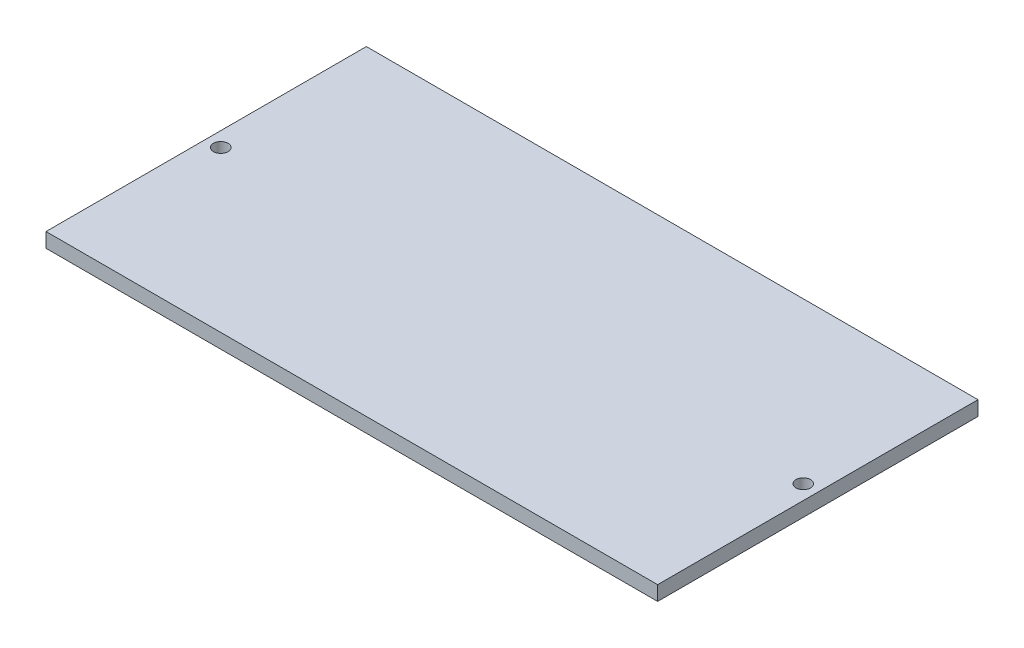
ISO-10303-21;
HEADER;
FILE_DESCRIPTION(('STEP AP214'),'2;1');
FILE_NAME('part.step','',(''),(''),'','','');
FILE_SCHEMA(('AUTOMOTIVE_DESIGN { 1 0 10303 214 1 1 1 1 }'));
ENDSEC;
DATA;
#1=APPLICATION_CONTEXT('core data for automotive mechanical design processes');
#2=APPLICATION_PROTOCOL_DEFINITION('international standard','automotive_design',2000,#1);
#3=PRODUCT_CONTEXT('',#1,'mechanical');
#4=PRODUCT('Part','Part','',(#3));
#5=PRODUCT_RELATED_PRODUCT_CATEGORY('part','',(#4));
#6=PRODUCT_DEFINITION_FORMATION('','',#4);
#7=PRODUCT_DEFINITION_CONTEXT('part definition',#1,'design');
#8=PRODUCT_DEFINITION('design','',#6,#7);
#9=PRODUCT_DEFINITION_SHAPE('','',#8);
#10=(LENGTH_UNIT() NAMED_UNIT(*) SI_UNIT(.MILLI.,.METRE.));
#11=(NAMED_UNIT(*) PLANE_ANGLE_UNIT() SI_UNIT($,.RADIAN.));
#12=(NAMED_UNIT(*) SI_UNIT($,.STERADIAN.) SOLID_ANGLE_UNIT());
#13=UNCERTAINTY_MEASURE_WITH_UNIT(LENGTH_MEASURE(1.E-05),#10,'distance_accuracy_value','');
#14=(GEOMETRIC_REPRESENTATION_CONTEXT(3) GLOBAL_UNCERTAINTY_ASSIGNED_CONTEXT((#13)) GLOBAL_UNIT_ASSIGNED_CONTEXT((#10,
#11,#12)) REPRESENTATION_CONTEXT('',''));
#15=CARTESIAN_POINT('',(0.,0.,0.));
#16=DIRECTION('',(0.,0.,1.));
#17=DIRECTION('',(1.,0.,0.));
#18=AXIS2_PLACEMENT_3D('',#15,#16,#17);
#19=CARTESIAN_POINT('',(42.,2.,-22.));
#20=DIRECTION('',(-1.,0.,0.));
#21=DIRECTION('',(0.,0.,1.));
#22=AXIS2_PLACEMENT_3D('',#19,#20,#21);
#23=PLANE('',#22);
#24=DIRECTION('',(0.,0.,-1.));
#25=VECTOR('',#24,1.);
#26=CARTESIAN_POINT('',(42.,0.,-22.));
#27=LINE('',#26,#25);
#28=CARTESIAN_POINT('',(42.,0.,22.));
#29=VERTEX_POINT('',#28);
#30=CARTESIAN_POINT('',(42.,0.,-22.));
#31=VERTEX_POINT('',#30);
#32=EDGE_CURVE('E113',#29,#31,#27,.T.);
#33=ORIENTED_EDGE('',*,*,#32,.T.);
#34=DIRECTION('',(0.,-1.,0.));
#35=VECTOR('',#34,1.);
#36=CARTESIAN_POINT('',(42.,2.,-22.));
#37=LINE('',#36,#35);
#38=CARTESIAN_POINT('',(42.,2.,-22.));
#39=VERTEX_POINT('',#38);
#40=EDGE_CURVE('E11',#39,#31,#37,.T.);
#41=ORIENTED_EDGE('',*,*,#40,.F.);
#42=DIRECTION('',(0.,0.,-1.));
#43=VECTOR('',#42,1.);
#44=CARTESIAN_POINT('',(42.,2.,-22.));
#45=LINE('',#44,#43);
#46=CARTESIAN_POINT('',(42.,2.,22.));
#47=VERTEX_POINT('',#46);
#48=EDGE_CURVE('E96',#47,#39,#45,.T.);
#49=ORIENTED_EDGE('',*,*,#48,.F.);
#50=DIRECTION('',(0.,-1.,0.));
#51=VECTOR('',#50,1.);
#52=CARTESIAN_POINT('',(42.,2.,22.));
#53=LINE('',#52,#51);
#54=EDGE_CURVE('E109',#47,#29,#53,.T.);
#55=ORIENTED_EDGE('',*,*,#54,.T.);
#56=EDGE_LOOP('',(#33,#41,#49,#55));
#57=FACE_BOUND('',#56,.T.);
#58=ADVANCED_FACE('F42',(#57),#23,.F.);
#59=CARTESIAN_POINT('',(-42.,2.,-22.));
#60=DIRECTION('',(0.,0.,1.));
#61=DIRECTION('',(1.,0.,0.));
#62=AXIS2_PLACEMENT_3D('',#59,#60,#61);
#63=PLANE('',#62);
#64=DIRECTION('',(-1.,0.,0.));
#65=VECTOR('',#64,1.);
#66=CARTESIAN_POINT('',(-42.,0.,-22.));
#67=LINE('',#66,#65);
#68=CARTESIAN_POINT('',(-42.,0.,-22.));
#69=VERTEX_POINT('',#68);
#70=EDGE_CURVE('E101',#31,#69,#67,.T.);
#71=ORIENTED_EDGE('',*,*,#70,.T.);
#72=DIRECTION('',(0.,-1.,0.));
#73=VECTOR('',#72,1.);
#74=CARTESIAN_POINT('',(-42.,2.,-22.));
#75=LINE('',#74,#73);
#76=CARTESIAN_POINT('',(-42.,2.,-22.));
#77=VERTEX_POINT('',#76);
#78=EDGE_CURVE('E52',#77,#69,#75,.T.);
#79=ORIENTED_EDGE('',*,*,#78,.F.);
#80=DIRECTION('',(-1.,0.,0.));
#81=VECTOR('',#80,1.);
#82=CARTESIAN_POINT('',(-42.,2.,-22.));
#83=LINE('',#82,#81);
#84=EDGE_CURVE('E91',#39,#77,#83,.T.);
#85=ORIENTED_EDGE('',*,*,#84,.F.);
#86=ORIENTED_EDGE('',*,*,#40,.T.);
#87=EDGE_LOOP('',(#71,#79,#85,#86));
#88=FACE_BOUND('',#87,.T.);
#89=ADVANCED_FACE('F100',(#88),#63,.F.);
#90=CARTESIAN_POINT('',(-42.,2.,-22.));
#91=DIRECTION('',(1.,0.,0.));
#92=DIRECTION('',(0.,0.,-1.));
#93=AXIS2_PLACEMENT_3D('',#90,#91,#92);
#94=PLANE('',#93);
#95=DIRECTION('',(0.,0.,1.));
#96=VECTOR('',#95,1.);
#97=CARTESIAN_POINT('',(-42.,0.,-22.));
#98=LINE('',#97,#96);
#99=CARTESIAN_POINT('',(-42.,0.,22.));
#100=VERTEX_POINT('',#99);
#101=EDGE_CURVE('E78',#69,#100,#98,.T.);
#102=ORIENTED_EDGE('',*,*,#101,.T.);
#103=DIRECTION('',(0.,-1.,0.));
#104=VECTOR('',#103,1.);
#105=CARTESIAN_POINT('',(-42.,2.,22.));
#106=LINE('',#105,#104);
#107=CARTESIAN_POINT('',(-42.,2.,22.));
#108=VERTEX_POINT('',#107);
#109=EDGE_CURVE('E103',#108,#100,#106,.T.);
#110=ORIENTED_EDGE('',*,*,#109,.F.);
#111=DIRECTION('',(0.,0.,1.));
#112=VECTOR('',#111,1.);
#113=CARTESIAN_POINT('',(-42.,2.,-22.));
#114=LINE('',#113,#112);
#115=EDGE_CURVE('E94',#77,#108,#114,.T.);
#116=ORIENTED_EDGE('',*,*,#115,.F.);
#117=ORIENTED_EDGE('',*,*,#78,.T.);
#118=EDGE_LOOP('',(#102,#110,#116,#117));
#119=FACE_BOUND('',#118,.T.);
#120=ADVANCED_FACE('F105',(#119),#94,.F.);
#121=CARTESIAN_POINT('',(-42.,2.,22.));
#122=DIRECTION('',(0.,0.,-1.));
#123=DIRECTION('',(-1.,0.,0.));
#124=AXIS2_PLACEMENT_3D('',#121,#122,#123);
#125=PLANE('',#124);
#126=DIRECTION('',(1.,0.,0.));
#127=VECTOR('',#126,1.);
#128=CARTESIAN_POINT('',(-42.,0.,22.));
#129=LINE('',#128,#127);
#130=EDGE_CURVE('E84',#100,#29,#129,.T.);
#131=ORIENTED_EDGE('',*,*,#130,.T.);
#132=ORIENTED_EDGE('',*,*,#54,.F.);
#133=DIRECTION('',(1.,0.,0.));
#134=VECTOR('',#133,1.);
#135=CARTESIAN_POINT('',(-42.,2.,22.));
#136=LINE('',#135,#134);
#137=EDGE_CURVE('E61',#108,#47,#136,.T.);
#138=ORIENTED_EDGE('',*,*,#137,.F.);
#139=ORIENTED_EDGE('',*,*,#109,.T.);
#140=EDGE_LOOP('',(#131,#132,#138,#139));
#141=FACE_BOUND('',#140,.T.);
#142=ADVANCED_FACE('F151',(#141),#125,.F.);
#143=CARTESIAN_POINT('',(0.,2.,0.));
#144=DIRECTION('',(0.,1.,0.));
#145=DIRECTION('',(0.,0.,1.));
#146=AXIS2_PLACEMENT_3D('',#143,#144,#145);
#147=PLANE('',#146);
#148=CARTESIAN_POINT('',(-40.,2.,0.));
#149=DIRECTION('',(0.,1.,0.));
#150=DIRECTION('',(0.,0.,1.));
#151=AXIS2_PLACEMENT_3D('',#148,#149,#150);
#152=CIRCLE('',#151,0.999999999999998);
#153=CARTESIAN_POINT('',(-40.,2.,1.));
#154=VERTEX_POINT('',#153);
#155=EDGE_CURVE('E129',#154,#154,#152,.T.);
#156=ORIENTED_EDGE('',*,*,#155,.F.);
#157=EDGE_LOOP('',(#156));
#158=FACE_BOUND('',#157,.T.);
#159=CARTESIAN_POINT('',(40.,2.,0.));
#160=DIRECTION('',(0.,1.,0.));
#161=DIRECTION('',(0.,0.,1.));
#162=AXIS2_PLACEMENT_3D('',#159,#160,#161);
#163=CIRCLE('',#162,0.999999999999998);
#164=CARTESIAN_POINT('',(40.,2.,1.));
#165=VERTEX_POINT('',#164);
#166=EDGE_CURVE('E136',#165,#165,#163,.T.);
#167=ORIENTED_EDGE('',*,*,#166,.F.);
#168=EDGE_LOOP('',(#167));
#169=FACE_BOUND('',#168,.T.);
#170=ORIENTED_EDGE('',*,*,#48,.T.);
#171=ORIENTED_EDGE('',*,*,#84,.T.);
#172=ORIENTED_EDGE('',*,*,#115,.T.);
#173=ORIENTED_EDGE('',*,*,#137,.T.);
#174=EDGE_LOOP('',(#170,#171,#172,#173));
#175=FACE_BOUND('',#174,.T.);
#176=ADVANCED_FACE('F92',(#158,#169,#175),#147,.T.);
#177=CARTESIAN_POINT('',(0.,0.,0.));
#178=DIRECTION('',(0.,1.,0.));
#179=DIRECTION('',(0.,0.,1.));
#180=AXIS2_PLACEMENT_3D('',#177,#178,#179);
#181=PLANE('',#180);
#182=CARTESIAN_POINT('',(-40.,0.,0.));
#183=DIRECTION('',(0.,1.,0.));
#184=DIRECTION('',(0.,0.,1.));
#185=AXIS2_PLACEMENT_3D('',#182,#183,#184);
#186=CIRCLE('',#185,0.999999999999998);
#187=CARTESIAN_POINT('',(-40.,0.,1.));
#188=VERTEX_POINT('',#187);
#189=EDGE_CURVE('E45',#188,#188,#186,.T.);
#190=ORIENTED_EDGE('',*,*,#189,.T.);
#191=EDGE_LOOP('',(#190));
#192=FACE_BOUND('',#191,.T.);
#193=CARTESIAN_POINT('',(40.,0.,0.));
#194=DIRECTION('',(0.,1.,0.));
#195=DIRECTION('',(0.,0.,1.));
#196=AXIS2_PLACEMENT_3D('',#193,#194,#195);
#197=CIRCLE('',#196,0.999999999999998);
#198=CARTESIAN_POINT('',(40.,0.,1.));
#199=VERTEX_POINT('',#198);
#200=EDGE_CURVE('E126',#199,#199,#197,.T.);
#201=ORIENTED_EDGE('',*,*,#200,.T.);
#202=EDGE_LOOP('',(#201));
#203=FACE_BOUND('',#202,.T.);
#204=ORIENTED_EDGE('',*,*,#32,.F.);
#205=ORIENTED_EDGE('',*,*,#130,.F.);
#206=ORIENTED_EDGE('',*,*,#101,.F.);
#207=ORIENTED_EDGE('',*,*,#70,.F.);
#208=EDGE_LOOP('',(#204,#205,#206,#207));
#209=FACE_BOUND('',#208,.T.);
#210=ADVANCED_FACE('F150',(#192,#203,#209),#181,.F.);
#211=CARTESIAN_POINT('',(40.,-8.,0.));
#212=DIRECTION('',(0.,1.,0.));
#213=DIRECTION('',(0.,0.,1.));
#214=AXIS2_PLACEMENT_3D('',#211,#212,#213);
#215=CYLINDRICAL_SURFACE('',#214,0.999999999999998);
#216=ORIENTED_EDGE('',*,*,#166,.T.);
#217=EDGE_LOOP('',(#216));
#218=FACE_BOUND('',#217,.T.);
#219=ORIENTED_EDGE('',*,*,#200,.F.);
#220=EDGE_LOOP('',(#219));
#221=FACE_BOUND('',#220,.T.);
#222=ADVANCED_FACE('F146',(#218,#221),#215,.F.);
#223=CARTESIAN_POINT('',(-40.,-8.,0.));
#224=DIRECTION('',(0.,1.,0.));
#225=DIRECTION('',(0.,0.,1.));
#226=AXIS2_PLACEMENT_3D('',#223,#224,#225);
#227=CYLINDRICAL_SURFACE('',#226,0.999999999999998);
#228=ORIENTED_EDGE('',*,*,#155,.T.);
#229=EDGE_LOOP('',(#228));
#230=FACE_BOUND('',#229,.T.);
#231=ORIENTED_EDGE('',*,*,#189,.F.);
#232=EDGE_LOOP('',(#231));
#233=FACE_BOUND('',#232,.T.);
#234=ADVANCED_FACE('F198',(#230,#233),#227,.F.);
#235=CLOSED_SHELL('',(#58,#89,#120,#142,#176,#210,#222,#234));
#236=MANIFOLD_SOLID_BREP('B2',#235);
#237=ADVANCED_BREP_SHAPE_REPRESENTATION('',(#18,#236),#14);
#238=SHAPE_DEFINITION_REPRESENTATION(#9,#237);
ENDSEC;
END-ISO-10303-21;
